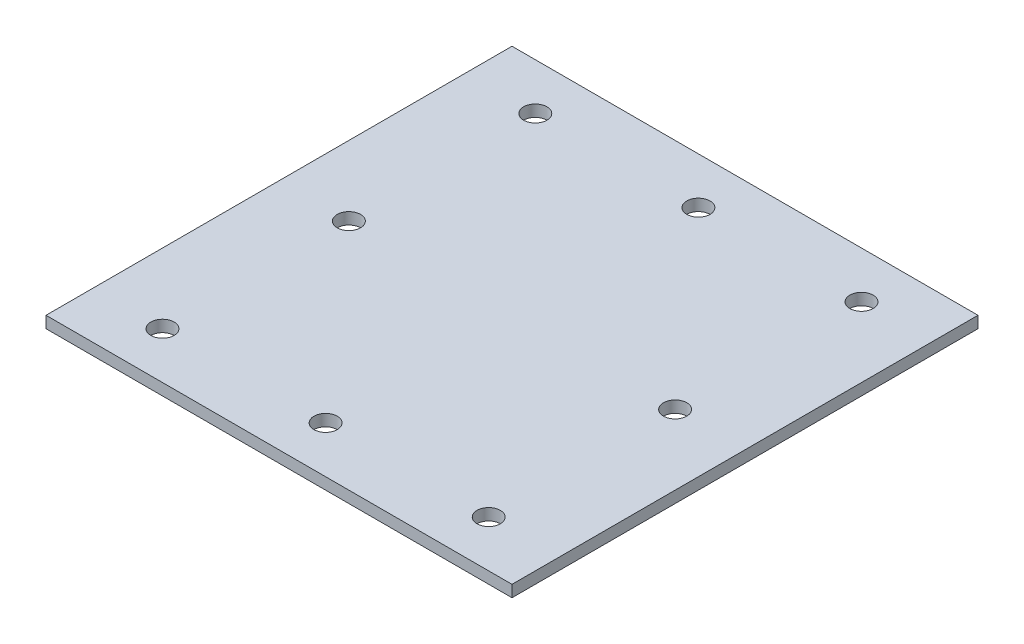
ISO-10303-21;
HEADER;
FILE_DESCRIPTION(('STEP AP214'),'2;1');
FILE_NAME('part.step','',(''),(''),'','','');
FILE_SCHEMA(('AUTOMOTIVE_DESIGN { 1 0 10303 214 1 1 1 1 }'));
ENDSEC;
DATA;
#1=APPLICATION_CONTEXT('core data for automotive mechanical design processes');
#2=APPLICATION_PROTOCOL_DEFINITION('international standard','automotive_design',2000,#1);
#3=PRODUCT_CONTEXT('',#1,'mechanical');
#4=PRODUCT('Part','Part','',(#3));
#5=PRODUCT_RELATED_PRODUCT_CATEGORY('part','',(#4));
#6=PRODUCT_DEFINITION_FORMATION('','',#4);
#7=PRODUCT_DEFINITION_CONTEXT('part definition',#1,'design');
#8=PRODUCT_DEFINITION('design','',#6,#7);
#9=PRODUCT_DEFINITION_SHAPE('','',#8);
#10=(LENGTH_UNIT() NAMED_UNIT(*) SI_UNIT(.MILLI.,.METRE.));
#11=(NAMED_UNIT(*) PLANE_ANGLE_UNIT() SI_UNIT($,.RADIAN.));
#12=(NAMED_UNIT(*) SI_UNIT($,.STERADIAN.) SOLID_ANGLE_UNIT());
#13=UNCERTAINTY_MEASURE_WITH_UNIT(LENGTH_MEASURE(1.E-05),#10,'distance_accuracy_value','');
#14=(GEOMETRIC_REPRESENTATION_CONTEXT(3) GLOBAL_UNCERTAINTY_ASSIGNED_CONTEXT((#13)) GLOBAL_UNIT_ASSIGNED_CONTEXT((#10,
#11,#12)) REPRESENTATION_CONTEXT('',''));
#15=CARTESIAN_POINT('',(0.,0.,0.));
#16=DIRECTION('',(0.,0.,1.));
#17=DIRECTION('',(1.,0.,0.));
#18=AXIS2_PLACEMENT_3D('',#15,#16,#17);
#19=CARTESIAN_POINT('',(-254.,12.7,-254.));
#20=DIRECTION('',(1.,0.,0.));
#21=DIRECTION('',(0.,0.,-1.));
#22=AXIS2_PLACEMENT_3D('',#19,#20,#21);
#23=PLANE('',#22);
#24=DIRECTION('',(0.,0.,1.));
#25=VECTOR('',#24,1.);
#26=CARTESIAN_POINT('',(-254.,0.,-254.));
#27=LINE('',#26,#25);
#28=CARTESIAN_POINT('',(-254.,0.,-254.));
#29=VERTEX_POINT('',#28);
#30=CARTESIAN_POINT('',(-254.,0.,254.));
#31=VERTEX_POINT('',#30);
#32=EDGE_CURVE('E105',#29,#31,#27,.T.);
#33=ORIENTED_EDGE('',*,*,#32,.T.);
#34=DIRECTION('',(0.,-1.,0.));
#35=VECTOR('',#34,1.);
#36=CARTESIAN_POINT('',(-254.,12.7,254.));
#37=LINE('',#36,#35);
#38=CARTESIAN_POINT('',(-254.,12.7,254.));
#39=VERTEX_POINT('',#38);
#40=EDGE_CURVE('E12',#39,#31,#37,.T.);
#41=ORIENTED_EDGE('',*,*,#40,.F.);
#42=DIRECTION('',(0.,0.,1.));
#43=VECTOR('',#42,1.);
#44=CARTESIAN_POINT('',(-254.,12.7,-254.));
#45=LINE('',#44,#43);
#46=CARTESIAN_POINT('',(-254.,12.7,-254.));
#47=VERTEX_POINT('',#46);
#48=EDGE_CURVE('E93',#47,#39,#45,.T.);
#49=ORIENTED_EDGE('',*,*,#48,.F.);
#50=DIRECTION('',(0.,-1.,0.));
#51=VECTOR('',#50,1.);
#52=CARTESIAN_POINT('',(-254.,12.7,-254.));
#53=LINE('',#52,#51);
#54=EDGE_CURVE('E101',#47,#29,#53,.T.);
#55=ORIENTED_EDGE('',*,*,#54,.T.);
#56=EDGE_LOOP('',(#33,#41,#49,#55));
#57=FACE_BOUND('',#56,.T.);
#58=ADVANCED_FACE('F42',(#57),#23,.F.);
#59=CARTESIAN_POINT('',(254.,12.7,254.));
#60=DIRECTION('',(0.,0.,-1.));
#61=DIRECTION('',(-1.,0.,0.));
#62=AXIS2_PLACEMENT_3D('',#59,#60,#61);
#63=PLANE('',#62);
#64=DIRECTION('',(1.,0.,0.));
#65=VECTOR('',#64,1.);
#66=CARTESIAN_POINT('',(254.,0.,254.));
#67=LINE('',#66,#65);
#68=CARTESIAN_POINT('',(254.,0.,254.));
#69=VERTEX_POINT('',#68);
#70=EDGE_CURVE('E97',#31,#69,#67,.T.);
#71=ORIENTED_EDGE('',*,*,#70,.T.);
#72=DIRECTION('',(0.,-1.,0.));
#73=VECTOR('',#72,1.);
#74=CARTESIAN_POINT('',(254.,12.7,254.));
#75=LINE('',#74,#73);
#76=CARTESIAN_POINT('',(254.,12.7,254.));
#77=VERTEX_POINT('',#76);
#78=EDGE_CURVE('E50',#77,#69,#75,.T.);
#79=ORIENTED_EDGE('',*,*,#78,.F.);
#80=DIRECTION('',(1.,0.,0.));
#81=VECTOR('',#80,1.);
#82=CARTESIAN_POINT('',(254.,12.7,254.));
#83=LINE('',#82,#81);
#84=EDGE_CURVE('E88',#39,#77,#83,.T.);
#85=ORIENTED_EDGE('',*,*,#84,.F.);
#86=ORIENTED_EDGE('',*,*,#40,.T.);
#87=EDGE_LOOP('',(#71,#79,#85,#86));
#88=FACE_BOUND('',#87,.T.);
#89=ADVANCED_FACE('F96',(#88),#63,.F.);
#90=CARTESIAN_POINT('',(254.,12.7,-254.));
#91=DIRECTION('',(-1.,0.,0.));
#92=DIRECTION('',(0.,0.,1.));
#93=AXIS2_PLACEMENT_3D('',#90,#91,#92);
#94=PLANE('',#93);
#95=DIRECTION('',(0.,0.,-1.));
#96=VECTOR('',#95,1.);
#97=CARTESIAN_POINT('',(254.,0.,-254.));
#98=LINE('',#97,#96);
#99=CARTESIAN_POINT('',(254.,0.,-254.));
#100=VERTEX_POINT('',#99);
#101=EDGE_CURVE('E75',#69,#100,#98,.T.);
#102=ORIENTED_EDGE('',*,*,#101,.T.);
#103=DIRECTION('',(0.,-1.,0.));
#104=VECTOR('',#103,1.);
#105=CARTESIAN_POINT('',(254.,12.7,-254.));
#106=LINE('',#105,#104);
#107=CARTESIAN_POINT('',(254.,12.7,-254.));
#108=VERTEX_POINT('',#107);
#109=EDGE_CURVE('E98',#108,#100,#106,.T.);
#110=ORIENTED_EDGE('',*,*,#109,.F.);
#111=DIRECTION('',(0.,0.,-1.));
#112=VECTOR('',#111,1.);
#113=CARTESIAN_POINT('',(254.,12.7,-254.));
#114=LINE('',#113,#112);
#115=EDGE_CURVE('E91',#77,#108,#114,.T.);
#116=ORIENTED_EDGE('',*,*,#115,.F.);
#117=ORIENTED_EDGE('',*,*,#78,.T.);
#118=EDGE_LOOP('',(#102,#110,#116,#117));
#119=FACE_BOUND('',#118,.T.);
#120=ADVANCED_FACE('F99',(#119),#94,.F.);
#121=CARTESIAN_POINT('',(254.,12.7,-254.));
#122=DIRECTION('',(0.,0.,1.));
#123=DIRECTION('',(1.,0.,0.));
#124=AXIS2_PLACEMENT_3D('',#121,#122,#123);
#125=PLANE('',#124);
#126=DIRECTION('',(-1.,0.,0.));
#127=VECTOR('',#126,1.);
#128=CARTESIAN_POINT('',(254.,0.,-254.));
#129=LINE('',#128,#127);
#130=EDGE_CURVE('E81',#100,#29,#129,.T.);
#131=ORIENTED_EDGE('',*,*,#130,.T.);
#132=ORIENTED_EDGE('',*,*,#54,.F.);
#133=DIRECTION('',(-1.,0.,0.));
#134=VECTOR('',#133,1.);
#135=CARTESIAN_POINT('',(254.,12.7,-254.));
#136=LINE('',#135,#134);
#137=EDGE_CURVE('E58',#108,#47,#136,.T.);
#138=ORIENTED_EDGE('',*,*,#137,.F.);
#139=ORIENTED_EDGE('',*,*,#109,.T.);
#140=EDGE_LOOP('',(#131,#132,#138,#139));
#141=FACE_BOUND('',#140,.T.);
#142=ADVANCED_FACE('F113',(#141),#125,.F.);
#143=CARTESIAN_POINT('',(0.,12.7,0.));
#144=DIRECTION('',(0.,-1.,0.));
#145=DIRECTION('',(0.,0.,-1.));
#146=AXIS2_PLACEMENT_3D('',#143,#144,#145);
#147=PLANE('',#146);
#148=CARTESIAN_POINT('',(177.8,12.7,203.2));
#149=DIRECTION('',(0.,1.,0.));
#150=DIRECTION('',(0.,0.,1.));
#151=AXIS2_PLACEMENT_3D('',#148,#149,#150);
#152=CIRCLE('',#151,12.7);
#153=CARTESIAN_POINT('',(177.8,12.7,215.9));
#154=VERTEX_POINT('',#153);
#155=EDGE_CURVE('E122',#154,#154,#152,.T.);
#156=ORIENTED_EDGE('',*,*,#155,.F.);
#157=EDGE_LOOP('',(#156));
#158=FACE_BOUND('',#157,.T.);
#159=CARTESIAN_POINT('',(0.,12.7,203.2));
#160=DIRECTION('',(0.,1.,0.));
#161=DIRECTION('',(0.,0.,1.));
#162=AXIS2_PLACEMENT_3D('',#159,#160,#161);
#163=CIRCLE('',#162,12.7);
#164=CARTESIAN_POINT('',(0.,12.7,215.9));
#165=VERTEX_POINT('',#164);
#166=EDGE_CURVE('E141',#165,#165,#163,.T.);
#167=ORIENTED_EDGE('',*,*,#166,.F.);
#168=EDGE_LOOP('',(#167));
#169=FACE_BOUND('',#168,.T.);
#170=CARTESIAN_POINT('',(-177.8,12.7,-203.2));
#171=DIRECTION('',(0.,1.,0.));
#172=DIRECTION('',(0.,0.,1.));
#173=AXIS2_PLACEMENT_3D('',#170,#171,#172);
#174=CIRCLE('',#173,12.7);
#175=CARTESIAN_POINT('',(-177.8,12.7,-190.5));
#176=VERTEX_POINT('',#175);
#177=EDGE_CURVE('E135',#176,#176,#174,.T.);
#178=ORIENTED_EDGE('',*,*,#177,.F.);
#179=EDGE_LOOP('',(#178));
#180=FACE_BOUND('',#179,.T.);
#181=CARTESIAN_POINT('',(177.8,12.7,-1.38777878078145E-13));
#182=DIRECTION('',(0.,1.,0.));
#183=DIRECTION('',(0.,0.,1.));
#184=AXIS2_PLACEMENT_3D('',#181,#182,#183);
#185=CIRCLE('',#184,12.7);
#186=CARTESIAN_POINT('',(177.8,12.7,12.6999999999999));
#187=VERTEX_POINT('',#186);
#188=EDGE_CURVE('E128',#187,#187,#185,.T.);
#189=ORIENTED_EDGE('',*,*,#188,.F.);
#190=EDGE_LOOP('',(#189));
#191=FACE_BOUND('',#190,.T.);
#192=CARTESIAN_POINT('',(177.8,12.7,-203.2));
#193=DIRECTION('',(0.,1.,0.));
#194=DIRECTION('',(0.,0.,1.));
#195=AXIS2_PLACEMENT_3D('',#192,#193,#194);
#196=CIRCLE('',#195,12.7);
#197=CARTESIAN_POINT('',(177.8,12.7,-190.5));
#198=VERTEX_POINT('',#197);
#199=EDGE_CURVE('E129',#198,#198,#196,.T.);
#200=ORIENTED_EDGE('',*,*,#199,.F.);
#201=EDGE_LOOP('',(#200));
#202=FACE_BOUND('',#201,.T.);
#203=CARTESIAN_POINT('',(0.,12.7,-203.2));
#204=DIRECTION('',(0.,1.,0.));
#205=DIRECTION('',(0.,0.,1.));
#206=AXIS2_PLACEMENT_3D('',#203,#204,#205);
#207=CIRCLE('',#206,12.7);
#208=CARTESIAN_POINT('',(0.,12.7,-190.5));
#209=VERTEX_POINT('',#208);
#210=EDGE_CURVE('E158',#209,#209,#207,.T.);
#211=ORIENTED_EDGE('',*,*,#210,.F.);
#212=EDGE_LOOP('',(#211));
#213=FACE_BOUND('',#212,.T.);
#214=CARTESIAN_POINT('',(-177.8,12.7,0.));
#215=DIRECTION('',(0.,1.,0.));
#216=DIRECTION('',(0.,0.,1.));
#217=AXIS2_PLACEMENT_3D('',#214,#215,#216);
#218=CIRCLE('',#217,12.7);
#219=CARTESIAN_POINT('',(-177.8,12.7,12.6999999999999));
#220=VERTEX_POINT('',#219);
#221=EDGE_CURVE('E152',#220,#220,#218,.T.);
#222=ORIENTED_EDGE('',*,*,#221,.F.);
#223=EDGE_LOOP('',(#222));
#224=FACE_BOUND('',#223,.T.);
#225=CARTESIAN_POINT('',(-177.8,12.7,203.2));
#226=DIRECTION('',(0.,1.,0.));
#227=DIRECTION('',(0.,0.,1.));
#228=AXIS2_PLACEMENT_3D('',#225,#226,#227);
#229=CIRCLE('',#228,12.7);
#230=CARTESIAN_POINT('',(-177.8,12.7,215.9));
#231=VERTEX_POINT('',#230);
#232=EDGE_CURVE('E119',#231,#231,#229,.T.);
#233=ORIENTED_EDGE('',*,*,#232,.F.);
#234=EDGE_LOOP('',(#233));
#235=FACE_BOUND('',#234,.T.);
#236=ORIENTED_EDGE('',*,*,#48,.T.);
#237=ORIENTED_EDGE('',*,*,#84,.T.);
#238=ORIENTED_EDGE('',*,*,#115,.T.);
#239=ORIENTED_EDGE('',*,*,#137,.T.);
#240=EDGE_LOOP('',(#236,#237,#238,#239));
#241=FACE_BOUND('',#240,.T.);
#242=ADVANCED_FACE('F89',(#158,#169,#180,#191,#202,#213,#224,#235,#241),#147,.F.);
#243=CARTESIAN_POINT('',(0.,0.,0.));
#244=DIRECTION('',(0.,-1.,0.));
#245=DIRECTION('',(0.,0.,-1.));
#246=AXIS2_PLACEMENT_3D('',#243,#244,#245);
#247=PLANE('',#246);
#248=CARTESIAN_POINT('',(177.8,0.,203.2));
#249=DIRECTION('',(0.,1.,0.));
#250=DIRECTION('',(0.,0.,1.));
#251=AXIS2_PLACEMENT_3D('',#248,#249,#250);
#252=CIRCLE('',#251,12.7);
#253=CARTESIAN_POINT('',(177.8,0.,215.9));
#254=VERTEX_POINT('',#253);
#255=EDGE_CURVE('E144',#254,#254,#252,.T.);
#256=ORIENTED_EDGE('',*,*,#255,.T.);
#257=EDGE_LOOP('',(#256));
#258=FACE_BOUND('',#257,.T.);
#259=CARTESIAN_POINT('',(0.,0.,203.2));
#260=DIRECTION('',(0.,1.,0.));
#261=DIRECTION('',(0.,0.,1.));
#262=AXIS2_PLACEMENT_3D('',#259,#260,#261);
#263=CIRCLE('',#262,12.7);
#264=CARTESIAN_POINT('',(0.,0.,215.9));
#265=VERTEX_POINT('',#264);
#266=EDGE_CURVE('E138',#265,#265,#263,.T.);
#267=ORIENTED_EDGE('',*,*,#266,.T.);
#268=EDGE_LOOP('',(#267));
#269=FACE_BOUND('',#268,.T.);
#270=CARTESIAN_POINT('',(-177.8,0.,-203.2));
#271=DIRECTION('',(0.,1.,0.));
#272=DIRECTION('',(0.,0.,1.));
#273=AXIS2_PLACEMENT_3D('',#270,#271,#272);
#274=CIRCLE('',#273,12.7);
#275=CARTESIAN_POINT('',(-177.8,0.,-190.5));
#276=VERTEX_POINT('',#275);
#277=EDGE_CURVE('E132',#276,#276,#274,.T.);
#278=ORIENTED_EDGE('',*,*,#277,.T.);
#279=EDGE_LOOP('',(#278));
#280=FACE_BOUND('',#279,.T.);
#281=CARTESIAN_POINT('',(177.8,0.,-1.38777878078145E-13));
#282=DIRECTION('',(0.,1.,0.));
#283=DIRECTION('',(0.,0.,1.));
#284=AXIS2_PLACEMENT_3D('',#281,#282,#283);
#285=CIRCLE('',#284,12.7);
#286=CARTESIAN_POINT('',(177.8,0.,12.6999999999999));
#287=VERTEX_POINT('',#286);
#288=EDGE_CURVE('E125',#287,#287,#285,.T.);
#289=ORIENTED_EDGE('',*,*,#288,.T.);
#290=EDGE_LOOP('',(#289));
#291=FACE_BOUND('',#290,.T.);
#292=CARTESIAN_POINT('',(177.8,0.,-203.2));
#293=DIRECTION('',(0.,1.,0.));
#294=DIRECTION('',(0.,0.,1.));
#295=AXIS2_PLACEMENT_3D('',#292,#293,#294);
#296=CIRCLE('',#295,12.7);
#297=CARTESIAN_POINT('',(177.8,0.,-190.5));
#298=VERTEX_POINT('',#297);
#299=EDGE_CURVE('E161',#298,#298,#296,.T.);
#300=ORIENTED_EDGE('',*,*,#299,.T.);
#301=EDGE_LOOP('',(#300));
#302=FACE_BOUND('',#301,.T.);
#303=CARTESIAN_POINT('',(0.,0.,-203.2));
#304=DIRECTION('',(0.,1.,0.));
#305=DIRECTION('',(0.,0.,1.));
#306=AXIS2_PLACEMENT_3D('',#303,#304,#305);
#307=CIRCLE('',#306,12.7);
#308=CARTESIAN_POINT('',(0.,0.,-190.5));
#309=VERTEX_POINT('',#308);
#310=EDGE_CURVE('E155',#309,#309,#307,.T.);
#311=ORIENTED_EDGE('',*,*,#310,.T.);
#312=EDGE_LOOP('',(#311));
#313=FACE_BOUND('',#312,.T.);
#314=CARTESIAN_POINT('',(-177.8,0.,0.));
#315=DIRECTION('',(0.,1.,0.));
#316=DIRECTION('',(0.,0.,1.));
#317=AXIS2_PLACEMENT_3D('',#314,#315,#316);
#318=CIRCLE('',#317,12.7);
#319=CARTESIAN_POINT('',(-177.8,0.,12.6999999999999));
#320=VERTEX_POINT('',#319);
#321=EDGE_CURVE('E149',#320,#320,#318,.T.);
#322=ORIENTED_EDGE('',*,*,#321,.T.);
#323=EDGE_LOOP('',(#322));
#324=FACE_BOUND('',#323,.T.);
#325=CARTESIAN_POINT('',(-177.8,0.,203.2));
#326=DIRECTION('',(0.,1.,0.));
#327=DIRECTION('',(0.,0.,1.));
#328=AXIS2_PLACEMENT_3D('',#325,#326,#327);
#329=CIRCLE('',#328,12.7);
#330=CARTESIAN_POINT('',(-177.8,0.,215.9));
#331=VERTEX_POINT('',#330);
#332=EDGE_CURVE('E108',#331,#331,#329,.T.);
#333=ORIENTED_EDGE('',*,*,#332,.T.);
#334=EDGE_LOOP('',(#333));
#335=FACE_BOUND('',#334,.T.);
#336=ORIENTED_EDGE('',*,*,#32,.F.);
#337=ORIENTED_EDGE('',*,*,#130,.F.);
#338=ORIENTED_EDGE('',*,*,#101,.F.);
#339=ORIENTED_EDGE('',*,*,#70,.F.);
#340=EDGE_LOOP('',(#336,#337,#338,#339));
#341=FACE_BOUND('',#340,.T.);
#342=ADVANCED_FACE('F116',(#258,#269,#280,#291,#302,#313,#324,#335,#341),#247,.T.);
#343=CARTESIAN_POINT('',(-177.8,0.,203.2));
#344=DIRECTION('',(0.,1.,0.));
#345=DIRECTION('',(0.,0.,1.));
#346=AXIS2_PLACEMENT_3D('',#343,#344,#345);
#347=CYLINDRICAL_SURFACE('',#346,12.7);
#348=ORIENTED_EDGE('',*,*,#332,.F.);
#349=EDGE_LOOP('',(#348));
#350=FACE_BOUND('',#349,.T.);
#351=ORIENTED_EDGE('',*,*,#232,.T.);
#352=EDGE_LOOP('',(#351));
#353=FACE_BOUND('',#352,.T.);
#354=ADVANCED_FACE('F179',(#350,#353),#347,.F.);
#355=CARTESIAN_POINT('',(-177.8,0.,0.));
#356=DIRECTION('',(0.,1.,0.));
#357=DIRECTION('',(0.,0.,1.));
#358=AXIS2_PLACEMENT_3D('',#355,#356,#357);
#359=CYLINDRICAL_SURFACE('',#358,12.7);
#360=ORIENTED_EDGE('',*,*,#321,.F.);
#361=EDGE_LOOP('',(#360));
#362=FACE_BOUND('',#361,.T.);
#363=ORIENTED_EDGE('',*,*,#221,.T.);
#364=EDGE_LOOP('',(#363));
#365=FACE_BOUND('',#364,.T.);
#366=ADVANCED_FACE('F181',(#362,#365),#359,.F.);
#367=CARTESIAN_POINT('',(0.,0.,-203.2));
#368=DIRECTION('',(0.,1.,0.));
#369=DIRECTION('',(0.,0.,1.));
#370=AXIS2_PLACEMENT_3D('',#367,#368,#369);
#371=CYLINDRICAL_SURFACE('',#370,12.7);
#372=ORIENTED_EDGE('',*,*,#310,.F.);
#373=EDGE_LOOP('',(#372));
#374=FACE_BOUND('',#373,.T.);
#375=ORIENTED_EDGE('',*,*,#210,.T.);
#376=EDGE_LOOP('',(#375));
#377=FACE_BOUND('',#376,.T.);
#378=ADVANCED_FACE('F188',(#374,#377),#371,.F.);
#379=CARTESIAN_POINT('',(177.8,0.,-203.2));
#380=DIRECTION('',(0.,1.,0.));
#381=DIRECTION('',(0.,0.,1.));
#382=AXIS2_PLACEMENT_3D('',#379,#380,#381);
#383=CYLINDRICAL_SURFACE('',#382,12.7);
#384=ORIENTED_EDGE('',*,*,#299,.F.);
#385=EDGE_LOOP('',(#384));
#386=FACE_BOUND('',#385,.T.);
#387=ORIENTED_EDGE('',*,*,#199,.T.);
#388=EDGE_LOOP('',(#387));
#389=FACE_BOUND('',#388,.T.);
#390=ADVANCED_FACE('F167',(#386,#389),#383,.F.);
#391=CARTESIAN_POINT('',(177.8,0.,-1.38777878078145E-13));
#392=DIRECTION('',(0.,1.,0.));
#393=DIRECTION('',(0.,0.,1.));
#394=AXIS2_PLACEMENT_3D('',#391,#392,#393);
#395=CYLINDRICAL_SURFACE('',#394,12.7);
#396=ORIENTED_EDGE('',*,*,#288,.F.);
#397=EDGE_LOOP('',(#396));
#398=FACE_BOUND('',#397,.T.);
#399=ORIENTED_EDGE('',*,*,#188,.T.);
#400=EDGE_LOOP('',(#399));
#401=FACE_BOUND('',#400,.T.);
#402=ADVANCED_FACE('F245',(#398,#401),#395,.F.);
#403=CARTESIAN_POINT('',(-177.8,0.,-203.2));
#404=DIRECTION('',(0.,1.,0.));
#405=DIRECTION('',(0.,0.,1.));
#406=AXIS2_PLACEMENT_3D('',#403,#404,#405);
#407=CYLINDRICAL_SURFACE('',#406,12.7);
#408=ORIENTED_EDGE('',*,*,#277,.F.);
#409=EDGE_LOOP('',(#408));
#410=FACE_BOUND('',#409,.T.);
#411=ORIENTED_EDGE('',*,*,#177,.T.);
#412=EDGE_LOOP('',(#411));
#413=FACE_BOUND('',#412,.T.);
#414=ADVANCED_FACE('F255',(#410,#413),#407,.F.);
#415=CARTESIAN_POINT('',(0.,0.,203.2));
#416=DIRECTION('',(0.,1.,0.));
#417=DIRECTION('',(0.,0.,1.));
#418=AXIS2_PLACEMENT_3D('',#415,#416,#417);
#419=CYLINDRICAL_SURFACE('',#418,12.7);
#420=ORIENTED_EDGE('',*,*,#266,.F.);
#421=EDGE_LOOP('',(#420));
#422=FACE_BOUND('',#421,.T.);
#423=ORIENTED_EDGE('',*,*,#166,.T.);
#424=EDGE_LOOP('',(#423));
#425=FACE_BOUND('',#424,.T.);
#426=ADVANCED_FACE('F264',(#422,#425),#419,.F.);
#427=CARTESIAN_POINT('',(177.8,0.,203.2));
#428=DIRECTION('',(0.,1.,0.));
#429=DIRECTION('',(0.,0.,1.));
#430=AXIS2_PLACEMENT_3D('',#427,#428,#429);
#431=CYLINDRICAL_SURFACE('',#430,12.7);
#432=ORIENTED_EDGE('',*,*,#255,.F.);
#433=EDGE_LOOP('',(#432));
#434=FACE_BOUND('',#433,.T.);
#435=ORIENTED_EDGE('',*,*,#155,.T.);
#436=EDGE_LOOP('',(#435));
#437=FACE_BOUND('',#436,.T.);
#438=ADVANCED_FACE('F275',(#434,#437),#431,.F.);
#439=CLOSED_SHELL('',(#58,#89,#120,#142,#242,#342,#354,#366,#378,#390,#402,#414,#426,#438));
#440=MANIFOLD_SOLID_BREP('B2',#439);
#441=ADVANCED_BREP_SHAPE_REPRESENTATION('',(#18,#440),#14);
#442=SHAPE_DEFINITION_REPRESENTATION(#9,#441);
ENDSEC;
END-ISO-10303-21;
